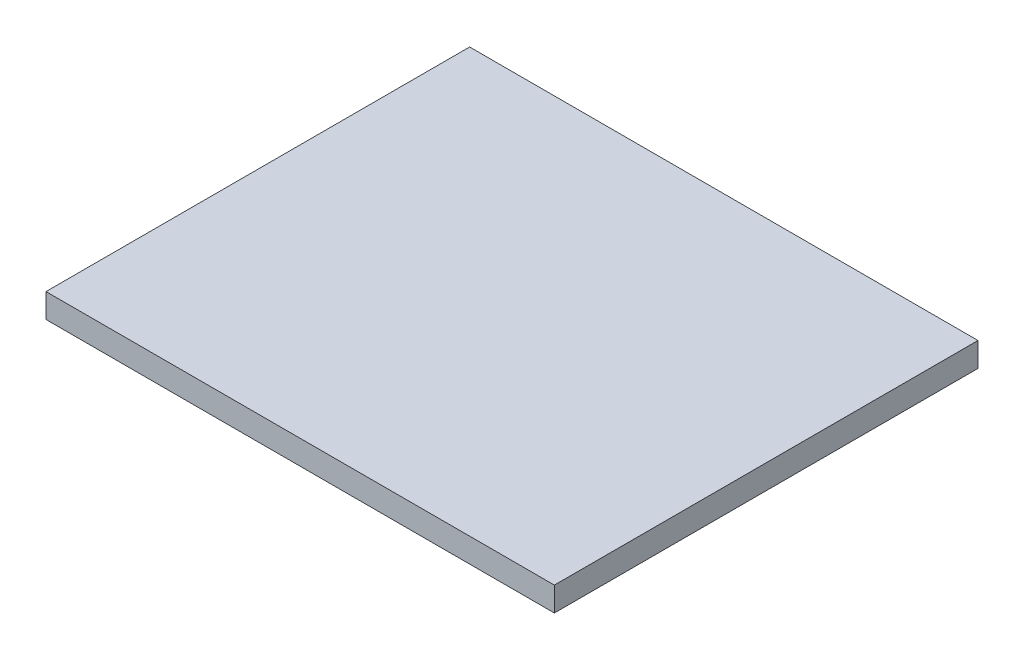
ISO-10303-21;
HEADER;
FILE_DESCRIPTION(('STEP AP214'),'2;1');
FILE_NAME('part.step','',(''),(''),'','','');
FILE_SCHEMA(('AUTOMOTIVE_DESIGN { 1 0 10303 214 1 1 1 1 }'));
ENDSEC;
DATA;
#1=APPLICATION_CONTEXT('core data for automotive mechanical design processes');
#2=APPLICATION_PROTOCOL_DEFINITION('international standard','automotive_design',2000,#1);
#3=PRODUCT_CONTEXT('',#1,'mechanical');
#4=PRODUCT('Part','Part','',(#3));
#5=PRODUCT_RELATED_PRODUCT_CATEGORY('part','',(#4));
#6=PRODUCT_DEFINITION_FORMATION('','',#4);
#7=PRODUCT_DEFINITION_CONTEXT('part definition',#1,'design');
#8=PRODUCT_DEFINITION('design','',#6,#7);
#9=PRODUCT_DEFINITION_SHAPE('','',#8);
#10=(LENGTH_UNIT() NAMED_UNIT(*) SI_UNIT(.MILLI.,.METRE.));
#11=(NAMED_UNIT(*) PLANE_ANGLE_UNIT() SI_UNIT($,.RADIAN.));
#12=(NAMED_UNIT(*) SI_UNIT($,.STERADIAN.) SOLID_ANGLE_UNIT());
#13=UNCERTAINTY_MEASURE_WITH_UNIT(LENGTH_MEASURE(1.E-05),#10,'distance_accuracy_value','');
#14=(GEOMETRIC_REPRESENTATION_CONTEXT(3) GLOBAL_UNCERTAINTY_ASSIGNED_CONTEXT((#13)) GLOBAL_UNIT_ASSIGNED_CONTEXT((#10,
#11,#12)) REPRESENTATION_CONTEXT('',''));
#15=CARTESIAN_POINT('',(0.,0.,0.));
#16=DIRECTION('',(0.,0.,1.));
#17=DIRECTION('',(1.,0.,0.));
#18=AXIS2_PLACEMENT_3D('',#15,#16,#17);
#19=CARTESIAN_POINT('',(-21.,2.,-17.5));
#20=DIRECTION('',(1.,0.,0.));
#21=DIRECTION('',(0.,0.,-1.));
#22=AXIS2_PLACEMENT_3D('',#19,#20,#21);
#23=PLANE('',#22);
#24=DIRECTION('',(0.,0.,1.));
#25=VECTOR('',#24,1.);
#26=CARTESIAN_POINT('',(-21.,0.,-17.5));
#27=LINE('',#26,#25);
#28=CARTESIAN_POINT('',(-21.,0.,-17.5));
#29=VERTEX_POINT('',#28);
#30=CARTESIAN_POINT('',(-21.,0.,17.5));
#31=VERTEX_POINT('',#30);
#32=EDGE_CURVE('E95',#29,#31,#27,.T.);
#33=ORIENTED_EDGE('',*,*,#32,.T.);
#34=DIRECTION('',(0.,-1.,0.));
#35=VECTOR('',#34,1.);
#36=CARTESIAN_POINT('',(-21.,2.,17.5));
#37=LINE('',#36,#35);
#38=CARTESIAN_POINT('',(-21.,2.,17.5));
#39=VERTEX_POINT('',#38);
#40=EDGE_CURVE('E11',#39,#31,#37,.T.);
#41=ORIENTED_EDGE('',*,*,#40,.F.);
#42=DIRECTION('',(0.,0.,1.));
#43=VECTOR('',#42,1.);
#44=CARTESIAN_POINT('',(-21.,2.,-17.5));
#45=LINE('',#44,#43);
#46=CARTESIAN_POINT('',(-21.,2.,-17.5));
#47=VERTEX_POINT('',#46);
#48=EDGE_CURVE('E83',#47,#39,#45,.T.);
#49=ORIENTED_EDGE('',*,*,#48,.F.);
#50=DIRECTION('',(0.,-1.,0.));
#51=VECTOR('',#50,1.);
#52=CARTESIAN_POINT('',(-21.,2.,-17.5));
#53=LINE('',#52,#51);
#54=EDGE_CURVE('E91',#47,#29,#53,.T.);
#55=ORIENTED_EDGE('',*,*,#54,.T.);
#56=EDGE_LOOP('',(#33,#41,#49,#55));
#57=FACE_BOUND('',#56,.T.);
#58=ADVANCED_FACE('F32',(#57),#23,.F.);
#59=CARTESIAN_POINT('',(21.,2.,17.5));
#60=DIRECTION('',(0.,0.,-1.));
#61=DIRECTION('',(-1.,0.,0.));
#62=AXIS2_PLACEMENT_3D('',#59,#60,#61);
#63=PLANE('',#62);
#64=DIRECTION('',(1.,0.,0.));
#65=VECTOR('',#64,1.);
#66=CARTESIAN_POINT('',(21.,0.,17.5));
#67=LINE('',#66,#65);
#68=CARTESIAN_POINT('',(21.,0.,17.5));
#69=VERTEX_POINT('',#68);
#70=EDGE_CURVE('E87',#31,#69,#67,.T.);
#71=ORIENTED_EDGE('',*,*,#70,.T.);
#72=DIRECTION('',(0.,-1.,0.));
#73=VECTOR('',#72,1.);
#74=CARTESIAN_POINT('',(21.,2.,17.5));
#75=LINE('',#74,#73);
#76=CARTESIAN_POINT('',(21.,2.,17.5));
#77=VERTEX_POINT('',#76);
#78=EDGE_CURVE('E40',#77,#69,#75,.T.);
#79=ORIENTED_EDGE('',*,*,#78,.F.);
#80=DIRECTION('',(1.,0.,0.));
#81=VECTOR('',#80,1.);
#82=CARTESIAN_POINT('',(21.,2.,17.5));
#83=LINE('',#82,#81);
#84=EDGE_CURVE('E78',#39,#77,#83,.T.);
#85=ORIENTED_EDGE('',*,*,#84,.F.);
#86=ORIENTED_EDGE('',*,*,#40,.T.);
#87=EDGE_LOOP('',(#71,#79,#85,#86));
#88=FACE_BOUND('',#87,.T.);
#89=ADVANCED_FACE('F86',(#88),#63,.F.);
#90=CARTESIAN_POINT('',(21.,2.,-17.5));
#91=DIRECTION('',(-1.,0.,0.));
#92=DIRECTION('',(0.,0.,1.));
#93=AXIS2_PLACEMENT_3D('',#90,#91,#92);
#94=PLANE('',#93);
#95=DIRECTION('',(0.,0.,-1.));
#96=VECTOR('',#95,1.);
#97=CARTESIAN_POINT('',(21.,0.,-17.5));
#98=LINE('',#97,#96);
#99=CARTESIAN_POINT('',(21.,0.,-17.5));
#100=VERTEX_POINT('',#99);
#101=EDGE_CURVE('E65',#69,#100,#98,.T.);
#102=ORIENTED_EDGE('',*,*,#101,.T.);
#103=DIRECTION('',(0.,-1.,0.));
#104=VECTOR('',#103,1.);
#105=CARTESIAN_POINT('',(21.,2.,-17.5));
#106=LINE('',#105,#104);
#107=CARTESIAN_POINT('',(21.,2.,-17.5));
#108=VERTEX_POINT('',#107);
#109=EDGE_CURVE('E88',#108,#100,#106,.T.);
#110=ORIENTED_EDGE('',*,*,#109,.F.);
#111=DIRECTION('',(0.,0.,-1.));
#112=VECTOR('',#111,1.);
#113=CARTESIAN_POINT('',(21.,2.,-17.5));
#114=LINE('',#113,#112);
#115=EDGE_CURVE('E81',#77,#108,#114,.T.);
#116=ORIENTED_EDGE('',*,*,#115,.F.);
#117=ORIENTED_EDGE('',*,*,#78,.T.);
#118=EDGE_LOOP('',(#102,#110,#116,#117));
#119=FACE_BOUND('',#118,.T.);
#120=ADVANCED_FACE('F89',(#119),#94,.F.);
#121=CARTESIAN_POINT('',(21.,2.,-17.5));
#122=DIRECTION('',(0.,0.,1.));
#123=DIRECTION('',(1.,0.,0.));
#124=AXIS2_PLACEMENT_3D('',#121,#122,#123);
#125=PLANE('',#124);
#126=DIRECTION('',(-1.,0.,0.));
#127=VECTOR('',#126,1.);
#128=CARTESIAN_POINT('',(21.,0.,-17.5));
#129=LINE('',#128,#127);
#130=EDGE_CURVE('E71',#100,#29,#129,.T.);
#131=ORIENTED_EDGE('',*,*,#130,.T.);
#132=ORIENTED_EDGE('',*,*,#54,.F.);
#133=DIRECTION('',(-1.,0.,0.));
#134=VECTOR('',#133,1.);
#135=CARTESIAN_POINT('',(21.,2.,-17.5));
#136=LINE('',#135,#134);
#137=EDGE_CURVE('E48',#108,#47,#136,.T.);
#138=ORIENTED_EDGE('',*,*,#137,.F.);
#139=ORIENTED_EDGE('',*,*,#109,.T.);
#140=EDGE_LOOP('',(#131,#132,#138,#139));
#141=FACE_BOUND('',#140,.T.);
#142=ADVANCED_FACE('F102',(#141),#125,.F.);
#143=CARTESIAN_POINT('',(0.,2.,0.));
#144=DIRECTION('',(0.,-1.,0.));
#145=DIRECTION('',(0.,0.,-1.));
#146=AXIS2_PLACEMENT_3D('',#143,#144,#145);
#147=PLANE('',#146);
#148=ORIENTED_EDGE('',*,*,#48,.T.);
#149=ORIENTED_EDGE('',*,*,#84,.T.);
#150=ORIENTED_EDGE('',*,*,#115,.T.);
#151=ORIENTED_EDGE('',*,*,#137,.T.);
#152=EDGE_LOOP('',(#148,#149,#150,#151));
#153=FACE_BOUND('',#152,.T.);
#154=ADVANCED_FACE('F79',(#153),#147,.F.);
#155=CARTESIAN_POINT('',(0.,0.,0.));
#156=DIRECTION('',(0.,-1.,0.));
#157=DIRECTION('',(0.,0.,-1.));
#158=AXIS2_PLACEMENT_3D('',#155,#156,#157);
#159=PLANE('',#158);
#160=ORIENTED_EDGE('',*,*,#32,.F.);
#161=ORIENTED_EDGE('',*,*,#130,.F.);
#162=ORIENTED_EDGE('',*,*,#101,.F.);
#163=ORIENTED_EDGE('',*,*,#70,.F.);
#164=EDGE_LOOP('',(#160,#161,#162,#163));
#165=FACE_BOUND('',#164,.T.);
#166=ADVANCED_FACE('F105',(#165),#159,.T.);
#167=CLOSED_SHELL('',(#58,#89,#120,#142,#154,#166));
#168=MANIFOLD_SOLID_BREP('B2',#167);
#169=ADVANCED_BREP_SHAPE_REPRESENTATION('',(#18,#168),#14);
#170=SHAPE_DEFINITION_REPRESENTATION(#9,#169);
ENDSEC;
END-ISO-10303-21;
